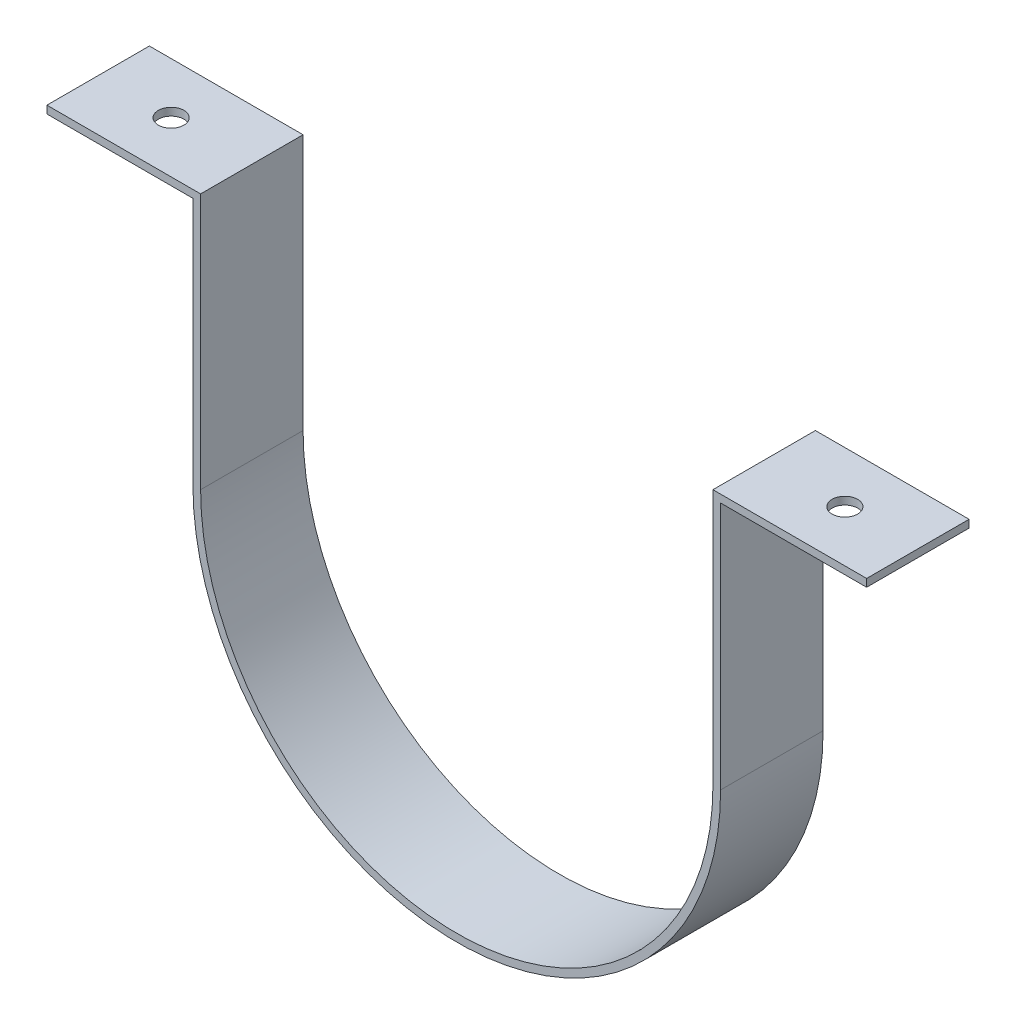
ISO-10303-21;
HEADER;
FILE_DESCRIPTION(('STEP AP214'),'2;1');
FILE_NAME('part.step','',(''),(''),'','','');
FILE_SCHEMA(('AUTOMOTIVE_DESIGN { 1 0 10303 214 1 1 1 1 }'));
ENDSEC;
DATA;
#1=APPLICATION_CONTEXT('core data for automotive mechanical design processes');
#2=APPLICATION_PROTOCOL_DEFINITION('international standard','automotive_design',2000,#1);
#3=PRODUCT_CONTEXT('',#1,'mechanical');
#4=PRODUCT('Part','Part','',(#3));
#5=PRODUCT_RELATED_PRODUCT_CATEGORY('part','',(#4));
#6=PRODUCT_DEFINITION_FORMATION('','',#4);
#7=PRODUCT_DEFINITION_CONTEXT('part definition',#1,'design');
#8=PRODUCT_DEFINITION('design','',#6,#7);
#9=PRODUCT_DEFINITION_SHAPE('','',#8);
#10=(LENGTH_UNIT() NAMED_UNIT(*) SI_UNIT(.MILLI.,.METRE.));
#11=(NAMED_UNIT(*) PLANE_ANGLE_UNIT() SI_UNIT($,.RADIAN.));
#12=(NAMED_UNIT(*) SI_UNIT($,.STERADIAN.) SOLID_ANGLE_UNIT());
#13=UNCERTAINTY_MEASURE_WITH_UNIT(LENGTH_MEASURE(1.E-05),#10,'distance_accuracy_value','');
#14=(GEOMETRIC_REPRESENTATION_CONTEXT(3) GLOBAL_UNCERTAINTY_ASSIGNED_CONTEXT((#13)) GLOBAL_UNIT_ASSIGNED_CONTEXT((#10,
#11,#12)) REPRESENTATION_CONTEXT('',''));
#15=CARTESIAN_POINT('',(0.,0.,0.));
#16=DIRECTION('',(0.,0.,1.));
#17=DIRECTION('',(1.,0.,0.));
#18=AXIS2_PLACEMENT_3D('',#15,#16,#17);
#19=CARTESIAN_POINT('',(90.1783724131082,0.,20.));
#20=DIRECTION('',(-1.,0.,0.));
#21=DIRECTION('',(0.,0.,1.));
#22=AXIS2_PLACEMENT_3D('',#19,#20,#21);
#23=PLANE('',#22);
#24=DIRECTION('',(0.,1.,0.));
#25=VECTOR('',#24,1.);
#26=CARTESIAN_POINT('',(90.1783724131082,0.,0.));
#27=LINE('',#26,#25);
#28=CARTESIAN_POINT('',(90.1783724131082,-7.72076374787895,0.));
#29=VERTEX_POINT('',#28);
#30=CARTESIAN_POINT('',(90.1783724131082,40.7792362521211,0.));
#31=VERTEX_POINT('',#30);
#32=EDGE_CURVE('E167',#29,#31,#27,.T.);
#33=ORIENTED_EDGE('',*,*,#32,.F.);
#34=DIRECTION('',(0.,0.,-1.));
#35=VECTOR('',#34,1.);
#36=CARTESIAN_POINT('',(90.1783724131082,-7.72076374787895,20.));
#37=LINE('',#36,#35);
#38=CARTESIAN_POINT('',(90.1783724131082,-7.72076374787895,20.));
#39=VERTEX_POINT('',#38);
#40=EDGE_CURVE('E13',#39,#29,#37,.T.);
#41=ORIENTED_EDGE('',*,*,#40,.F.);
#42=DIRECTION('',(0.,1.,0.));
#43=VECTOR('',#42,1.);
#44=CARTESIAN_POINT('',(90.1783724131082,0.,20.));
#45=LINE('',#44,#43);
#46=CARTESIAN_POINT('',(90.1783724131082,40.7792362521211,20.));
#47=VERTEX_POINT('',#46);
#48=EDGE_CURVE('E196',#39,#47,#45,.T.);
#49=ORIENTED_EDGE('',*,*,#48,.T.);
#50=DIRECTION('',(0.,0.,-1.));
#51=VECTOR('',#50,1.);
#52=CARTESIAN_POINT('',(90.1783724131082,40.7792362521211,20.));
#53=LINE('',#52,#51);
#54=EDGE_CURVE('E65',#47,#31,#53,.T.);
#55=ORIENTED_EDGE('',*,*,#54,.T.);
#56=EDGE_LOOP('',(#33,#41,#49,#55));
#57=FACE_BOUND('',#56,.T.);
#58=ADVANCED_FACE('F48',(#57),#23,.T.);
#59=CARTESIAN_POINT('',(141.678372413108,-7.72076374787895,20.));
#60=DIRECTION('',(0.,0.,-1.));
#61=DIRECTION('',(-1.,0.,0.));
#62=AXIS2_PLACEMENT_3D('',#59,#60,#61);
#63=CYLINDRICAL_SURFACE('',#62,51.5);
#64=CARTESIAN_POINT('',(141.678372413108,-7.72076374787895,0.));
#65=DIRECTION('',(0.,0.,1.));
#66=DIRECTION('',(1.,0.,0.));
#67=AXIS2_PLACEMENT_3D('',#64,#65,#66);
#68=CIRCLE('',#67,51.5);
#69=CARTESIAN_POINT('',(193.178372413108,-7.72076374787895,0.));
#70=VERTEX_POINT('',#69);
#71=EDGE_CURVE('E169',#29,#70,#68,.T.);
#72=ORIENTED_EDGE('',*,*,#71,.T.);
#73=DIRECTION('',(0.,0.,-1.));
#74=VECTOR('',#73,1.);
#75=CARTESIAN_POINT('',(193.178372413108,-7.72076374787895,20.));
#76=LINE('',#75,#74);
#77=CARTESIAN_POINT('',(193.178372413108,-7.72076374787895,20.));
#78=VERTEX_POINT('',#77);
#79=EDGE_CURVE('E57',#78,#70,#76,.T.);
#80=ORIENTED_EDGE('',*,*,#79,.F.);
#81=CARTESIAN_POINT('',(141.678372413108,-7.72076374787895,20.));
#82=DIRECTION('',(0.,0.,1.));
#83=DIRECTION('',(1.,0.,0.));
#84=AXIS2_PLACEMENT_3D('',#81,#82,#83);
#85=CIRCLE('',#84,51.5);
#86=EDGE_CURVE('E312',#39,#78,#85,.T.);
#87=ORIENTED_EDGE('',*,*,#86,.F.);
#88=ORIENTED_EDGE('',*,*,#40,.T.);
#89=EDGE_LOOP('',(#72,#80,#87,#88));
#90=FACE_BOUND('',#89,.T.);
#91=ADVANCED_FACE('F267',(#90),#63,.T.);
#92=CARTESIAN_POINT('',(193.178372413108,0.,20.));
#93=DIRECTION('',(-1.,0.,0.));
#94=DIRECTION('',(0.,0.,1.));
#95=AXIS2_PLACEMENT_3D('',#92,#93,#94);
#96=PLANE('',#95);
#97=DIRECTION('',(0.,1.,0.));
#98=VECTOR('',#97,1.);
#99=CARTESIAN_POINT('',(193.178372413108,0.,0.));
#100=LINE('',#99,#98);
#101=CARTESIAN_POINT('',(193.178372413108,40.7792362521211,0.));
#102=VERTEX_POINT('',#101);
#103=EDGE_CURVE('E171',#70,#102,#100,.T.);
#104=ORIENTED_EDGE('',*,*,#103,.T.);
#105=DIRECTION('',(0.,0.,-1.));
#106=VECTOR('',#105,1.);
#107=CARTESIAN_POINT('',(193.178372413108,40.7792362521211,20.));
#108=LINE('',#107,#106);
#109=CARTESIAN_POINT('',(193.178372413108,40.7792362521211,20.));
#110=VERTEX_POINT('',#109);
#111=EDGE_CURVE('E211',#110,#102,#108,.T.);
#112=ORIENTED_EDGE('',*,*,#111,.F.);
#113=DIRECTION('',(0.,1.,0.));
#114=VECTOR('',#113,1.);
#115=CARTESIAN_POINT('',(193.178372413108,0.,20.));
#116=LINE('',#115,#114);
#117=EDGE_CURVE('E221',#78,#110,#116,.T.);
#118=ORIENTED_EDGE('',*,*,#117,.F.);
#119=ORIENTED_EDGE('',*,*,#79,.T.);
#120=EDGE_LOOP('',(#104,#112,#118,#119));
#121=FACE_BOUND('',#120,.T.);
#122=ADVANCED_FACE('F219',(#121),#96,.F.);
#123=CARTESIAN_POINT('',(0.,40.7792362521211,20.));
#124=DIRECTION('',(0.,1.,0.));
#125=DIRECTION('',(0.,0.,1.));
#126=AXIS2_PLACEMENT_3D('',#123,#124,#125);
#127=PLANE('',#126);
#128=CARTESIAN_POINT('',(207.428372413108,40.7792362521211,10.));
#129=DIRECTION('',(0.,-1.,0.));
#130=DIRECTION('',(0.,0.,-1.));
#131=AXIS2_PLACEMENT_3D('',#128,#129,#130);
#132=CIRCLE('',#131,2.5);
#133=CARTESIAN_POINT('',(207.428372413108,40.7792362521211,7.50000000000001));
#134=VERTEX_POINT('',#133);
#135=EDGE_CURVE('E307',#134,#134,#132,.T.);
#136=ORIENTED_EDGE('',*,*,#135,.F.);
#137=EDGE_LOOP('',(#136));
#138=FACE_BOUND('',#137,.T.);
#139=DIRECTION('',(1.,0.,0.));
#140=VECTOR('',#139,1.);
#141=CARTESIAN_POINT('',(0.,40.7792362521211,0.));
#142=LINE('',#141,#140);
#143=CARTESIAN_POINT('',(221.678372413108,40.7792362521211,0.));
#144=VERTEX_POINT('',#143);
#145=EDGE_CURVE('E173',#102,#144,#142,.T.);
#146=ORIENTED_EDGE('',*,*,#145,.T.);
#147=DIRECTION('',(0.,0.,-1.));
#148=VECTOR('',#147,1.);
#149=CARTESIAN_POINT('',(221.678372413108,40.7792362521211,20.));
#150=LINE('',#149,#148);
#151=CARTESIAN_POINT('',(221.678372413108,40.7792362521211,20.));
#152=VERTEX_POINT('',#151);
#153=EDGE_CURVE('E208',#152,#144,#150,.T.);
#154=ORIENTED_EDGE('',*,*,#153,.F.);
#155=DIRECTION('',(1.,0.,0.));
#156=VECTOR('',#155,1.);
#157=CARTESIAN_POINT('',(0.,40.7792362521211,20.));
#158=LINE('',#157,#156);
#159=EDGE_CURVE('E240',#110,#152,#158,.T.);
#160=ORIENTED_EDGE('',*,*,#159,.F.);
#161=ORIENTED_EDGE('',*,*,#111,.T.);
#162=EDGE_LOOP('',(#146,#154,#160,#161));
#163=FACE_BOUND('',#162,.T.);
#164=ADVANCED_FACE('F230',(#138,#163),#127,.F.);
#165=CARTESIAN_POINT('',(221.678372413108,0.,20.));
#166=DIRECTION('',(-1.,0.,0.));
#167=DIRECTION('',(0.,0.,1.));
#168=AXIS2_PLACEMENT_3D('',#165,#166,#167);
#169=PLANE('',#168);
#170=DIRECTION('',(0.,1.,0.));
#171=VECTOR('',#170,1.);
#172=CARTESIAN_POINT('',(221.678372413108,0.,0.));
#173=LINE('',#172,#171);
#174=CARTESIAN_POINT('',(221.678372413108,42.2792362521211,0.));
#175=VERTEX_POINT('',#174);
#176=EDGE_CURVE('E175',#144,#175,#173,.T.);
#177=ORIENTED_EDGE('',*,*,#176,.T.);
#178=DIRECTION('',(0.,0.,-1.));
#179=VECTOR('',#178,1.);
#180=CARTESIAN_POINT('',(221.678372413108,42.2792362521211,20.));
#181=LINE('',#180,#179);
#182=CARTESIAN_POINT('',(221.678372413108,42.2792362521211,20.));
#183=VERTEX_POINT('',#182);
#184=EDGE_CURVE('E206',#183,#175,#181,.T.);
#185=ORIENTED_EDGE('',*,*,#184,.F.);
#186=DIRECTION('',(0.,1.,0.));
#187=VECTOR('',#186,1.);
#188=CARTESIAN_POINT('',(221.678372413108,0.,20.));
#189=LINE('',#188,#187);
#190=EDGE_CURVE('E236',#152,#183,#189,.T.);
#191=ORIENTED_EDGE('',*,*,#190,.F.);
#192=ORIENTED_EDGE('',*,*,#153,.T.);
#193=EDGE_LOOP('',(#177,#185,#191,#192));
#194=FACE_BOUND('',#193,.T.);
#195=ADVANCED_FACE('F234',(#194),#169,.F.);
#196=CARTESIAN_POINT('',(0.,42.2792362521211,20.));
#197=DIRECTION('',(0.,1.,0.));
#198=DIRECTION('',(0.,0.,1.));
#199=AXIS2_PLACEMENT_3D('',#196,#197,#198);
#200=PLANE('',#199);
#201=CARTESIAN_POINT('',(207.428372413108,42.2792362521211,10.));
#202=DIRECTION('',(0.,1.,0.));
#203=DIRECTION('',(0.,0.,1.));
#204=AXIS2_PLACEMENT_3D('',#201,#202,#203);
#205=CIRCLE('',#204,2.5);
#206=CARTESIAN_POINT('',(207.428372413108,42.2792362521211,12.5));
#207=VERTEX_POINT('',#206);
#208=EDGE_CURVE('E51',#207,#207,#205,.T.);
#209=ORIENTED_EDGE('',*,*,#208,.F.);
#210=EDGE_LOOP('',(#209));
#211=FACE_BOUND('',#210,.T.);
#212=DIRECTION('',(1.,0.,0.));
#213=VECTOR('',#212,1.);
#214=CARTESIAN_POINT('',(0.,42.2792362521211,0.));
#215=LINE('',#214,#213);
#216=CARTESIAN_POINT('',(191.678372413108,42.2792362521211,0.));
#217=VERTEX_POINT('',#216);
#218=EDGE_CURVE('E178',#217,#175,#215,.T.);
#219=ORIENTED_EDGE('',*,*,#218,.F.);
#220=DIRECTION('',(0.,0.,-1.));
#221=VECTOR('',#220,1.);
#222=CARTESIAN_POINT('',(191.678372413108,42.2792362521211,20.));
#223=LINE('',#222,#221);
#224=CARTESIAN_POINT('',(191.678372413108,42.2792362521211,20.));
#225=VERTEX_POINT('',#224);
#226=EDGE_CURVE('E204',#225,#217,#223,.T.);
#227=ORIENTED_EDGE('',*,*,#226,.F.);
#228=DIRECTION('',(1.,0.,0.));
#229=VECTOR('',#228,1.);
#230=CARTESIAN_POINT('',(0.,42.2792362521211,20.));
#231=LINE('',#230,#229);
#232=EDGE_CURVE('E239',#225,#183,#231,.T.);
#233=ORIENTED_EDGE('',*,*,#232,.T.);
#234=ORIENTED_EDGE('',*,*,#184,.T.);
#235=EDGE_LOOP('',(#219,#227,#233,#234));
#236=FACE_BOUND('',#235,.T.);
#237=ADVANCED_FACE('F281',(#211,#236),#200,.T.);
#238=CARTESIAN_POINT('',(191.678372413108,1.06402871187854E-13,20.));
#239=DIRECTION('',(1.,0.,0.));
#240=DIRECTION('',(0.,1.,0.));
#241=AXIS2_PLACEMENT_3D('',#238,#239,#240);
#242=PLANE('',#241);
#243=DIRECTION('',(0.,-1.,0.));
#244=VECTOR('',#243,1.);
#245=CARTESIAN_POINT('',(191.678372413108,1.06402871187854E-13,0.));
#246=LINE('',#245,#244);
#247=CARTESIAN_POINT('',(191.678372413108,-7.72076374787895,0.));
#248=VERTEX_POINT('',#247);
#249=EDGE_CURVE('E181',#217,#248,#246,.T.);
#250=ORIENTED_EDGE('',*,*,#249,.T.);
#251=DIRECTION('',(0.,0.,-1.));
#252=VECTOR('',#251,1.);
#253=CARTESIAN_POINT('',(191.678372413108,-7.72076374787895,20.));
#254=LINE('',#253,#252);
#255=CARTESIAN_POINT('',(191.678372413108,-7.72076374787895,20.));
#256=VERTEX_POINT('',#255);
#257=EDGE_CURVE('E202',#256,#248,#254,.T.);
#258=ORIENTED_EDGE('',*,*,#257,.F.);
#259=DIRECTION('',(0.,-1.,0.));
#260=VECTOR('',#259,1.);
#261=CARTESIAN_POINT('',(191.678372413108,1.06402871187854E-13,20.));
#262=LINE('',#261,#260);
#263=EDGE_CURVE('E242',#225,#256,#262,.T.);
#264=ORIENTED_EDGE('',*,*,#263,.F.);
#265=ORIENTED_EDGE('',*,*,#226,.T.);
#266=EDGE_LOOP('',(#250,#258,#264,#265));
#267=FACE_BOUND('',#266,.T.);
#268=ADVANCED_FACE('F284',(#267),#242,.F.);
#269=CARTESIAN_POINT('',(141.678372413108,-7.72076374787895,20.));
#270=DIRECTION('',(0.,0.,-1.));
#271=DIRECTION('',(-1.,0.,0.));
#272=AXIS2_PLACEMENT_3D('',#269,#270,#271);
#273=CYLINDRICAL_SURFACE('',#272,50.);
#274=CARTESIAN_POINT('',(141.678372413108,-7.72076374787895,0.));
#275=DIRECTION('',(0.,0.,1.));
#276=DIRECTION('',(1.,0.,0.));
#277=AXIS2_PLACEMENT_3D('',#274,#275,#276);
#278=CIRCLE('',#277,50.);
#279=CARTESIAN_POINT('',(91.6783724131082,-7.72076374787895,0.));
#280=VERTEX_POINT('',#279);
#281=EDGE_CURVE('E184',#280,#248,#278,.T.);
#282=ORIENTED_EDGE('',*,*,#281,.F.);
#283=DIRECTION('',(0.,0.,-1.));
#284=VECTOR('',#283,1.);
#285=CARTESIAN_POINT('',(91.6783724131082,-7.72076374787895,20.));
#286=LINE('',#285,#284);
#287=CARTESIAN_POINT('',(91.6783724131082,-7.72076374787895,20.));
#288=VERTEX_POINT('',#287);
#289=EDGE_CURVE('E200',#288,#280,#286,.T.);
#290=ORIENTED_EDGE('',*,*,#289,.F.);
#291=CARTESIAN_POINT('',(141.678372413108,-7.72076374787895,20.));
#292=DIRECTION('',(0.,0.,1.));
#293=DIRECTION('',(1.,0.,0.));
#294=AXIS2_PLACEMENT_3D('',#291,#292,#293);
#295=CIRCLE('',#294,50.);
#296=EDGE_CURVE('E248',#288,#256,#295,.T.);
#297=ORIENTED_EDGE('',*,*,#296,.T.);
#298=ORIENTED_EDGE('',*,*,#257,.T.);
#299=EDGE_LOOP('',(#282,#290,#297,#298));
#300=FACE_BOUND('',#299,.T.);
#301=ADVANCED_FACE('F288',(#300),#273,.F.);
#302=CARTESIAN_POINT('',(91.6783724131082,0.,20.));
#303=DIRECTION('',(1.,0.,0.));
#304=DIRECTION('',(0.,0.,-1.));
#305=AXIS2_PLACEMENT_3D('',#302,#303,#304);
#306=PLANE('',#305);
#307=DIRECTION('',(0.,-1.,0.));
#308=VECTOR('',#307,1.);
#309=CARTESIAN_POINT('',(91.6783724131082,0.,0.));
#310=LINE('',#309,#308);
#311=CARTESIAN_POINT('',(91.6783724131082,42.2792362521211,0.));
#312=VERTEX_POINT('',#311);
#313=EDGE_CURVE('E187',#312,#280,#310,.T.);
#314=ORIENTED_EDGE('',*,*,#313,.F.);
#315=DIRECTION('',(0.,0.,-1.));
#316=VECTOR('',#315,1.);
#317=CARTESIAN_POINT('',(91.6783724131082,42.2792362521211,20.));
#318=LINE('',#317,#316);
#319=CARTESIAN_POINT('',(91.6783724131082,42.2792362521211,20.));
#320=VERTEX_POINT('',#319);
#321=EDGE_CURVE('E159',#320,#312,#318,.T.);
#322=ORIENTED_EDGE('',*,*,#321,.F.);
#323=DIRECTION('',(0.,-1.,0.));
#324=VECTOR('',#323,1.);
#325=CARTESIAN_POINT('',(91.6783724131082,0.,20.));
#326=LINE('',#325,#324);
#327=EDGE_CURVE('E149',#320,#288,#326,.T.);
#328=ORIENTED_EDGE('',*,*,#327,.T.);
#329=ORIENTED_EDGE('',*,*,#289,.T.);
#330=EDGE_LOOP('',(#314,#322,#328,#329));
#331=FACE_BOUND('',#330,.T.);
#332=ADVANCED_FACE('F252',(#331),#306,.T.);
#333=CARTESIAN_POINT('',(0.,42.2792362521211,20.));
#334=DIRECTION('',(0.,-1.,0.));
#335=DIRECTION('',(1.,0.,0.));
#336=AXIS2_PLACEMENT_3D('',#333,#334,#335);
#337=PLANE('',#336);
#338=CARTESIAN_POINT('',(75.9283724131081,42.2792362521211,10.));
#339=DIRECTION('',(0.,-1.,0.));
#340=DIRECTION('',(1.,0.,0.));
#341=AXIS2_PLACEMENT_3D('',#338,#339,#340);
#342=CIRCLE('',#341,2.50000000000001);
#343=CARTESIAN_POINT('',(78.4283724131081,42.2792362521211,10.));
#344=VERTEX_POINT('',#343);
#345=EDGE_CURVE('E301',#344,#344,#342,.T.);
#346=ORIENTED_EDGE('',*,*,#345,.T.);
#347=EDGE_LOOP('',(#346));
#348=FACE_BOUND('',#347,.T.);
#349=DIRECTION('',(-1.,0.,0.));
#350=VECTOR('',#349,1.);
#351=CARTESIAN_POINT('',(0.,42.2792362521211,0.));
#352=LINE('',#351,#350);
#353=CARTESIAN_POINT('',(61.6783724131082,42.2792362521211,0.));
#354=VERTEX_POINT('',#353);
#355=EDGE_CURVE('E156',#312,#354,#352,.T.);
#356=ORIENTED_EDGE('',*,*,#355,.T.);
#357=DIRECTION('',(0.,0.,-1.));
#358=VECTOR('',#357,1.);
#359=CARTESIAN_POINT('',(61.6783724131082,42.2792362521211,20.));
#360=LINE('',#359,#358);
#361=CARTESIAN_POINT('',(61.6783724131082,42.2792362521211,20.));
#362=VERTEX_POINT('',#361);
#363=EDGE_CURVE('E153',#362,#354,#360,.T.);
#364=ORIENTED_EDGE('',*,*,#363,.F.);
#365=DIRECTION('',(-1.,0.,0.));
#366=VECTOR('',#365,1.);
#367=CARTESIAN_POINT('',(0.,42.2792362521211,20.));
#368=LINE('',#367,#366);
#369=EDGE_CURVE('E140',#320,#362,#368,.T.);
#370=ORIENTED_EDGE('',*,*,#369,.F.);
#371=ORIENTED_EDGE('',*,*,#321,.T.);
#372=EDGE_LOOP('',(#356,#364,#370,#371));
#373=FACE_BOUND('',#372,.T.);
#374=ADVANCED_FACE('F154',(#348,#373),#337,.F.);
#375=CARTESIAN_POINT('',(61.6783724131082,0.,20.));
#376=DIRECTION('',(-1.,0.,0.));
#377=DIRECTION('',(0.,0.,1.));
#378=AXIS2_PLACEMENT_3D('',#375,#376,#377);
#379=PLANE('',#378);
#380=DIRECTION('',(0.,1.,0.));
#381=VECTOR('',#380,1.);
#382=CARTESIAN_POINT('',(61.6783724131082,0.,0.));
#383=LINE('',#382,#381);
#384=CARTESIAN_POINT('',(61.6783724131082,40.7792362521211,0.));
#385=VERTEX_POINT('',#384);
#386=EDGE_CURVE('E191',#385,#354,#383,.T.);
#387=ORIENTED_EDGE('',*,*,#386,.F.);
#388=DIRECTION('',(0.,0.,-1.));
#389=VECTOR('',#388,1.);
#390=CARTESIAN_POINT('',(61.6783724131082,40.7792362521211,20.));
#391=LINE('',#390,#389);
#392=CARTESIAN_POINT('',(61.6783724131082,40.7792362521211,20.));
#393=VERTEX_POINT('',#392);
#394=EDGE_CURVE('E102',#393,#385,#391,.T.);
#395=ORIENTED_EDGE('',*,*,#394,.F.);
#396=DIRECTION('',(0.,1.,0.));
#397=VECTOR('',#396,1.);
#398=CARTESIAN_POINT('',(61.6783724131082,0.,20.));
#399=LINE('',#398,#397);
#400=EDGE_CURVE('E146',#393,#362,#399,.T.);
#401=ORIENTED_EDGE('',*,*,#400,.T.);
#402=ORIENTED_EDGE('',*,*,#363,.T.);
#403=EDGE_LOOP('',(#387,#395,#401,#402));
#404=FACE_BOUND('',#403,.T.);
#405=ADVANCED_FACE('F161',(#404),#379,.T.);
#406=CARTESIAN_POINT('',(0.,40.7792362521211,20.));
#407=DIRECTION('',(0.,-1.,0.));
#408=DIRECTION('',(1.,0.,0.));
#409=AXIS2_PLACEMENT_3D('',#406,#407,#408);
#410=PLANE('',#409);
#411=CARTESIAN_POINT('',(75.9283724131081,40.7792362521211,10.));
#412=DIRECTION('',(0.,-1.,0.));
#413=DIRECTION('',(0.,0.,-1.));
#414=AXIS2_PLACEMENT_3D('',#411,#412,#413);
#415=CIRCLE('',#414,2.50000000000001);
#416=CARTESIAN_POINT('',(75.9283724131081,40.7792362521211,7.49999999999999));
#417=VERTEX_POINT('',#416);
#418=EDGE_CURVE('E303',#417,#417,#415,.T.);
#419=ORIENTED_EDGE('',*,*,#418,.F.);
#420=EDGE_LOOP('',(#419));
#421=FACE_BOUND('',#420,.T.);
#422=DIRECTION('',(-1.,0.,0.));
#423=VECTOR('',#422,1.);
#424=CARTESIAN_POINT('',(0.,40.7792362521211,0.));
#425=LINE('',#424,#423);
#426=EDGE_CURVE('E193',#31,#385,#425,.T.);
#427=ORIENTED_EDGE('',*,*,#426,.F.);
#428=ORIENTED_EDGE('',*,*,#54,.F.);
#429=DIRECTION('',(-1.,0.,0.));
#430=VECTOR('',#429,1.);
#431=CARTESIAN_POINT('',(0.,40.7792362521211,20.));
#432=LINE('',#431,#430);
#433=EDGE_CURVE('E162',#47,#393,#432,.T.);
#434=ORIENTED_EDGE('',*,*,#433,.T.);
#435=ORIENTED_EDGE('',*,*,#394,.T.);
#436=EDGE_LOOP('',(#427,#428,#434,#435));
#437=FACE_BOUND('',#436,.T.);
#438=ADVANCED_FACE('F254',(#421,#437),#410,.T.);
#439=CARTESIAN_POINT('',(0.,0.,20.));
#440=DIRECTION('',(0.,0.,1.));
#441=DIRECTION('',(1.,0.,0.));
#442=AXIS2_PLACEMENT_3D('',#439,#440,#441);
#443=PLANE('',#442);
#444=ORIENTED_EDGE('',*,*,#48,.F.);
#445=ORIENTED_EDGE('',*,*,#86,.T.);
#446=ORIENTED_EDGE('',*,*,#117,.T.);
#447=ORIENTED_EDGE('',*,*,#159,.T.);
#448=ORIENTED_EDGE('',*,*,#190,.T.);
#449=ORIENTED_EDGE('',*,*,#232,.F.);
#450=ORIENTED_EDGE('',*,*,#263,.T.);
#451=ORIENTED_EDGE('',*,*,#296,.F.);
#452=ORIENTED_EDGE('',*,*,#327,.F.);
#453=ORIENTED_EDGE('',*,*,#369,.T.);
#454=ORIENTED_EDGE('',*,*,#400,.F.);
#455=ORIENTED_EDGE('',*,*,#433,.F.);
#456=EDGE_LOOP('',(#444,#445,#446,#447,#448,#449,#450,#451,#452,#453,#454,#455));
#457=FACE_BOUND('',#456,.T.);
#458=ADVANCED_FACE('F143',(#457),#443,.T.);
#459=CARTESIAN_POINT('',(0.,0.,0.));
#460=DIRECTION('',(0.,0.,1.));
#461=DIRECTION('',(1.,0.,0.));
#462=AXIS2_PLACEMENT_3D('',#459,#460,#461);
#463=PLANE('',#462);
#464=ORIENTED_EDGE('',*,*,#32,.T.);
#465=ORIENTED_EDGE('',*,*,#426,.T.);
#466=ORIENTED_EDGE('',*,*,#386,.T.);
#467=ORIENTED_EDGE('',*,*,#355,.F.);
#468=ORIENTED_EDGE('',*,*,#313,.T.);
#469=ORIENTED_EDGE('',*,*,#281,.T.);
#470=ORIENTED_EDGE('',*,*,#249,.F.);
#471=ORIENTED_EDGE('',*,*,#218,.T.);
#472=ORIENTED_EDGE('',*,*,#176,.F.);
#473=ORIENTED_EDGE('',*,*,#145,.F.);
#474=ORIENTED_EDGE('',*,*,#103,.F.);
#475=ORIENTED_EDGE('',*,*,#71,.F.);
#476=EDGE_LOOP('',(#464,#465,#466,#467,#468,#469,#470,#471,#472,#473,#474,#475));
#477=FACE_BOUND('',#476,.T.);
#478=ADVANCED_FACE('F226',(#477),#463,.F.);
#479=CARTESIAN_POINT('',(75.9283724131081,42.7792362521211,10.));
#480=DIRECTION('',(0.,-1.,0.));
#481=DIRECTION('',(0.,0.,-1.));
#482=AXIS2_PLACEMENT_3D('',#479,#480,#481);
#483=CYLINDRICAL_SURFACE('',#482,2.50000000000001);
#484=ORIENTED_EDGE('',*,*,#418,.T.);
#485=EDGE_LOOP('',(#484));
#486=FACE_BOUND('',#485,.T.);
#487=ORIENTED_EDGE('',*,*,#345,.F.);
#488=EDGE_LOOP('',(#487));
#489=FACE_BOUND('',#488,.T.);
#490=ADVANCED_FACE('F318',(#486,#489),#483,.F.);
#491=CARTESIAN_POINT('',(207.428372413108,42.7792362521211,10.));
#492=DIRECTION('',(0.,-1.,0.));
#493=DIRECTION('',(0.,0.,-1.));
#494=AXIS2_PLACEMENT_3D('',#491,#492,#493);
#495=CYLINDRICAL_SURFACE('',#494,2.5);
#496=ORIENTED_EDGE('',*,*,#208,.T.);
#497=EDGE_LOOP('',(#496));
#498=FACE_BOUND('',#497,.T.);
#499=ORIENTED_EDGE('',*,*,#135,.T.);
#500=EDGE_LOOP('',(#499));
#501=FACE_BOUND('',#500,.T.);
#502=ADVANCED_FACE('F316',(#498,#501),#495,.F.);
#503=CLOSED_SHELL('',(#58,#91,#122,#164,#195,#237,#268,#301,#332,#374,#405,#438,#458,#478,#490,#502));
#504=MANIFOLD_SOLID_BREP('B2',#503);
#505=ADVANCED_BREP_SHAPE_REPRESENTATION('',(#18,#504),#14);
#506=SHAPE_DEFINITION_REPRESENTATION(#9,#505);
ENDSEC;
END-ISO-10303-21;
